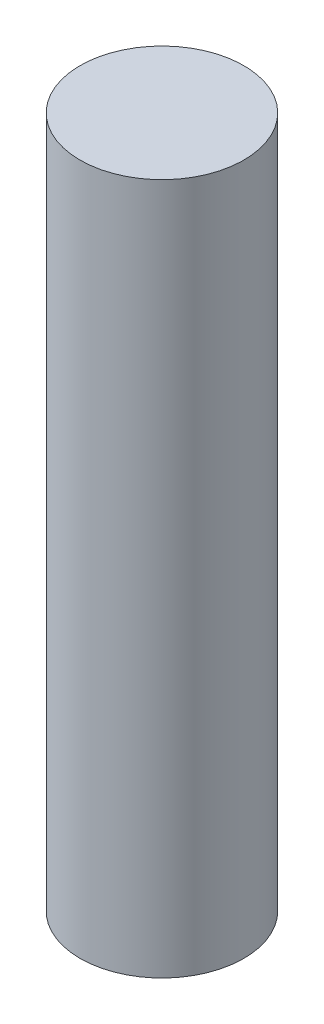
ISO-10303-21;
HEADER;
FILE_DESCRIPTION(('STEP AP214'),'2;1');
FILE_NAME('part.step','',(''),(''),'','','');
FILE_SCHEMA(('AUTOMOTIVE_DESIGN { 1 0 10303 214 1 1 1 1 }'));
ENDSEC;
DATA;
#1=APPLICATION_CONTEXT('core data for automotive mechanical design processes');
#2=APPLICATION_PROTOCOL_DEFINITION('international standard','automotive_design',2000,#1);
#3=PRODUCT_CONTEXT('',#1,'mechanical');
#4=PRODUCT('Part','Part','',(#3));
#5=PRODUCT_RELATED_PRODUCT_CATEGORY('part','',(#4));
#6=PRODUCT_DEFINITION_FORMATION('','',#4);
#7=PRODUCT_DEFINITION_CONTEXT('part definition',#1,'design');
#8=PRODUCT_DEFINITION('design','',#6,#7);
#9=PRODUCT_DEFINITION_SHAPE('','',#8);
#10=(LENGTH_UNIT() NAMED_UNIT(*) SI_UNIT(.MILLI.,.METRE.));
#11=(NAMED_UNIT(*) PLANE_ANGLE_UNIT() SI_UNIT($,.RADIAN.));
#12=(NAMED_UNIT(*) SI_UNIT($,.STERADIAN.) SOLID_ANGLE_UNIT());
#13=UNCERTAINTY_MEASURE_WITH_UNIT(LENGTH_MEASURE(1.E-05),#10,'distance_accuracy_value','');
#14=(GEOMETRIC_REPRESENTATION_CONTEXT(3) GLOBAL_UNCERTAINTY_ASSIGNED_CONTEXT((#13)) GLOBAL_UNIT_ASSIGNED_CONTEXT((#10,
#11,#12)) REPRESENTATION_CONTEXT('',''));
#15=CARTESIAN_POINT('',(0.,0.,0.));
#16=DIRECTION('',(0.,0.,1.));
#17=DIRECTION('',(1.,0.,0.));
#18=AXIS2_PLACEMENT_3D('',#15,#16,#17);
#19=CARTESIAN_POINT('',(0.,76.,0.));
#20=DIRECTION('',(0.,-1.,0.));
#21=DIRECTION('',(0.,0.,-1.));
#22=AXIS2_PLACEMENT_3D('',#19,#20,#21);
#23=CYLINDRICAL_SURFACE('',#22,9.);
#24=CARTESIAN_POINT('',(0.,76.,0.));
#25=DIRECTION('',(0.,1.,0.));
#26=DIRECTION('',(0.,0.,1.));
#27=AXIS2_PLACEMENT_3D('',#24,#25,#26);
#28=CIRCLE('',#27,9.);
#29=CARTESIAN_POINT('',(0.,76.,9.));
#30=VERTEX_POINT('',#29);
#31=EDGE_CURVE('E10',#30,#30,#28,.T.);
#32=ORIENTED_EDGE('',*,*,#31,.F.);
#33=EDGE_LOOP('',(#32));
#34=FACE_BOUND('',#33,.T.);
#35=CARTESIAN_POINT('',(0.,0.,0.));
#36=DIRECTION('',(0.,1.,0.));
#37=DIRECTION('',(0.,0.,1.));
#38=AXIS2_PLACEMENT_3D('',#35,#36,#37);
#39=CIRCLE('',#38,9.);
#40=CARTESIAN_POINT('',(0.,0.,9.));
#41=VERTEX_POINT('',#40);
#42=EDGE_CURVE('E46',#41,#41,#39,.T.);
#43=ORIENTED_EDGE('',*,*,#42,.T.);
#44=EDGE_LOOP('',(#43));
#45=FACE_BOUND('',#44,.T.);
#46=ADVANCED_FACE('F43',(#34,#45),#23,.T.);
#47=CARTESIAN_POINT('',(0.,76.,0.));
#48=DIRECTION('',(0.,1.,0.));
#49=DIRECTION('',(0.,0.,1.));
#50=AXIS2_PLACEMENT_3D('',#47,#48,#49);
#51=PLANE('',#50);
#52=ORIENTED_EDGE('',*,*,#31,.T.);
#53=EDGE_LOOP('',(#52));
#54=FACE_BOUND('',#53,.T.);
#55=ADVANCED_FACE('F60',(#54),#51,.T.);
#56=CARTESIAN_POINT('',(0.,0.,0.));
#57=DIRECTION('',(0.,1.,0.));
#58=DIRECTION('',(0.,0.,1.));
#59=AXIS2_PLACEMENT_3D('',#56,#57,#58);
#60=PLANE('',#59);
#61=ORIENTED_EDGE('',*,*,#42,.F.);
#62=EDGE_LOOP('',(#61));
#63=FACE_BOUND('',#62,.T.);
#64=ADVANCED_FACE('F58',(#63),#60,.F.);
#65=CLOSED_SHELL('',(#46,#55,#64));
#66=MANIFOLD_SOLID_BREP('B2',#65);
#67=ADVANCED_BREP_SHAPE_REPRESENTATION('',(#18,#66),#14);
#68=SHAPE_DEFINITION_REPRESENTATION(#9,#67);
ENDSEC;
END-ISO-10303-21;
